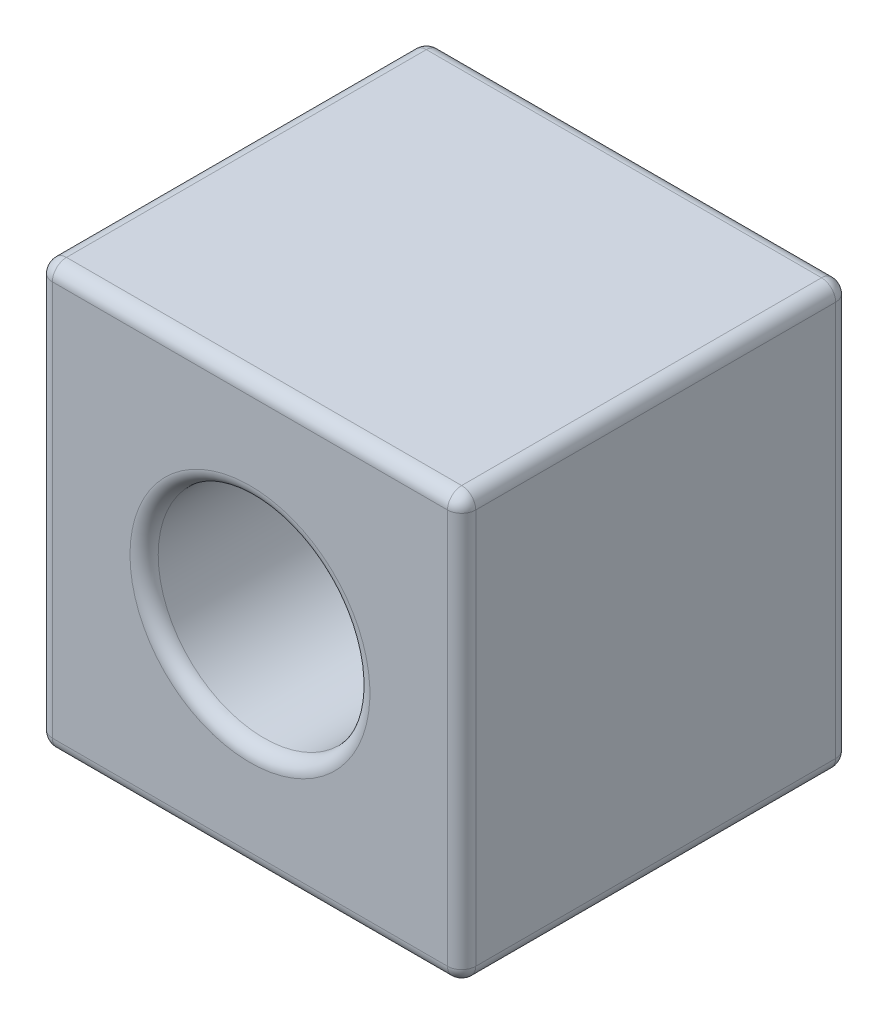
ISO-10303-21;
HEADER;
FILE_DESCRIPTION(('STEP AP214'),'2;1');
FILE_NAME('part.step','',(''),(''),'','','');
FILE_SCHEMA(('AUTOMOTIVE_DESIGN { 1 0 10303 214 1 1 1 1 }'));
ENDSEC;
DATA;
#1=APPLICATION_CONTEXT('core data for automotive mechanical design processes');
#2=APPLICATION_PROTOCOL_DEFINITION('international standard','automotive_design',2000,#1);
#3=PRODUCT_CONTEXT('',#1,'mechanical');
#4=PRODUCT('Part','Part','',(#3));
#5=PRODUCT_RELATED_PRODUCT_CATEGORY('part','',(#4));
#6=PRODUCT_DEFINITION_FORMATION('','',#4);
#7=PRODUCT_DEFINITION_CONTEXT('part definition',#1,'design');
#8=PRODUCT_DEFINITION('design','',#6,#7);
#9=PRODUCT_DEFINITION_SHAPE('','',#8);
#10=(LENGTH_UNIT() NAMED_UNIT(*) SI_UNIT(.MILLI.,.METRE.));
#11=(NAMED_UNIT(*) PLANE_ANGLE_UNIT() SI_UNIT($,.RADIAN.));
#12=(NAMED_UNIT(*) SI_UNIT($,.STERADIAN.) SOLID_ANGLE_UNIT());
#13=UNCERTAINTY_MEASURE_WITH_UNIT(LENGTH_MEASURE(1.E-05),#10,'distance_accuracy_value','');
#14=(GEOMETRIC_REPRESENTATION_CONTEXT(3) GLOBAL_UNCERTAINTY_ASSIGNED_CONTEXT((#13)) GLOBAL_UNIT_ASSIGNED_CONTEXT((#10,
#11,#12)) REPRESENTATION_CONTEXT('',''));
#15=CARTESIAN_POINT('',(0.,0.,0.));
#16=DIRECTION('',(0.,0.,1.));
#17=DIRECTION('',(1.,0.,0.));
#18=AXIS2_PLACEMENT_3D('',#15,#16,#17);
#19=CARTESIAN_POINT('',(-2.8,2.8,5.5));
#20=DIRECTION('',(0.,0.,-1.));
#21=DIRECTION('',(-1.,0.,0.));
#22=AXIS2_PLACEMENT_3D('',#19,#20,#21);
#23=PLANE('',#22);
#24=CARTESIAN_POINT('',(0.,0.,5.5));
#25=DIRECTION('',(0.,0.,-1.));
#26=DIRECTION('',(-1.,0.,0.));
#27=AXIS2_PLACEMENT_3D('',#24,#25,#26);
#28=CIRCLE('',#27,1.7);
#29=CARTESIAN_POINT('',(-1.7,0.,5.5));
#30=VERTEX_POINT('',#29);
#31=EDGE_CURVE('E11',#30,#30,#28,.T.);
#32=ORIENTED_EDGE('',*,*,#31,.T.);
#33=EDGE_LOOP('',(#32));
#34=FACE_BOUND('',#33,.T.);
#35=DIRECTION('',(0.,1.,0.));
#36=VECTOR('',#35,1.);
#37=CARTESIAN_POINT('',(2.8,2.8,5.5));
#38=LINE('',#37,#36);
#39=CARTESIAN_POINT('',(2.8,-2.8,5.5));
#40=VERTEX_POINT('',#39);
#41=CARTESIAN_POINT('',(2.8,2.8,5.5));
#42=VERTEX_POINT('',#41);
#43=EDGE_CURVE('E50',#40,#42,#38,.T.);
#44=ORIENTED_EDGE('',*,*,#43,.T.);
#45=DIRECTION('',(-1.,0.,0.));
#46=VECTOR('',#45,1.);
#47=CARTESIAN_POINT('',(-2.8,2.8,5.5));
#48=LINE('',#47,#46);
#49=CARTESIAN_POINT('',(-2.8,2.8,5.5));
#50=VERTEX_POINT('',#49);
#51=EDGE_CURVE('E43',#42,#50,#48,.T.);
#52=ORIENTED_EDGE('',*,*,#51,.T.);
#53=DIRECTION('',(0.,-1.,0.));
#54=VECTOR('',#53,1.);
#55=CARTESIAN_POINT('',(-2.8,2.8,5.5));
#56=LINE('',#55,#54);
#57=CARTESIAN_POINT('',(-2.8,-2.8,5.5));
#58=VERTEX_POINT('',#57);
#59=EDGE_CURVE('E206',#50,#58,#56,.T.);
#60=ORIENTED_EDGE('',*,*,#59,.T.);
#61=DIRECTION('',(1.,0.,0.));
#62=VECTOR('',#61,1.);
#63=CARTESIAN_POINT('',(-2.8,-2.8,5.5));
#64=LINE('',#63,#62);
#65=EDGE_CURVE('E55',#58,#40,#64,.T.);
#66=ORIENTED_EDGE('',*,*,#65,.T.);
#67=EDGE_LOOP('',(#44,#52,#60,#66));
#68=FACE_BOUND('',#67,.T.);
#69=ADVANCED_FACE('F35',(#34,#68),#23,.F.);
#70=CARTESIAN_POINT('',(-2.8,2.8,0.));
#71=DIRECTION('',(0.,0.,-1.));
#72=DIRECTION('',(-1.,0.,0.));
#73=AXIS2_PLACEMENT_3D('',#70,#71,#72);
#74=PLANE('',#73);
#75=CARTESIAN_POINT('',(0.,0.,0.));
#76=DIRECTION('',(0.,0.,-1.));
#77=DIRECTION('',(-1.,0.,0.));
#78=AXIS2_PLACEMENT_3D('',#75,#76,#77);
#79=CIRCLE('',#78,1.7);
#80=CARTESIAN_POINT('',(-1.7,0.,0.));
#81=VERTEX_POINT('',#80);
#82=EDGE_CURVE('E161',#81,#81,#79,.F.);
#83=ORIENTED_EDGE('',*,*,#82,.T.);
#84=EDGE_LOOP('',(#83));
#85=FACE_BOUND('',#84,.T.);
#86=DIRECTION('',(1.,0.,0.));
#87=VECTOR('',#86,1.);
#88=CARTESIAN_POINT('',(-2.8,-2.8,0.));
#89=LINE('',#88,#87);
#90=CARTESIAN_POINT('',(2.8,-2.8,0.));
#91=VERTEX_POINT('',#90);
#92=CARTESIAN_POINT('',(-2.8,-2.8,0.));
#93=VERTEX_POINT('',#92);
#94=EDGE_CURVE('E159',#91,#93,#89,.F.);
#95=ORIENTED_EDGE('',*,*,#94,.T.);
#96=DIRECTION('',(0.,-1.,0.));
#97=VECTOR('',#96,1.);
#98=CARTESIAN_POINT('',(-2.8,2.8,0.));
#99=LINE('',#98,#97);
#100=CARTESIAN_POINT('',(-2.8,2.8,0.));
#101=VERTEX_POINT('',#100);
#102=EDGE_CURVE('E129',#93,#101,#99,.F.);
#103=ORIENTED_EDGE('',*,*,#102,.T.);
#104=DIRECTION('',(-1.,0.,0.));
#105=VECTOR('',#104,1.);
#106=CARTESIAN_POINT('',(2.8,2.8,0.));
#107=LINE('',#106,#105);
#108=CARTESIAN_POINT('',(2.8,2.8,0.));
#109=VERTEX_POINT('',#108);
#110=EDGE_CURVE('E148',#101,#109,#107,.F.);
#111=ORIENTED_EDGE('',*,*,#110,.T.);
#112=DIRECTION('',(0.,1.,0.));
#113=VECTOR('',#112,1.);
#114=CARTESIAN_POINT('',(2.8,-2.8,0.));
#115=LINE('',#114,#113);
#116=EDGE_CURVE('E154',#109,#91,#115,.F.);
#117=ORIENTED_EDGE('',*,*,#116,.T.);
#118=EDGE_LOOP('',(#95,#103,#111,#117));
#119=FACE_BOUND('',#118,.T.);
#120=ADVANCED_FACE('F157',(#85,#119),#74,.T.);
#121=CARTESIAN_POINT('',(-2.8,2.8,5.5));
#122=DIRECTION('',(0.,0.,-1.));
#123=DIRECTION('',(-1.,0.,0.));
#124=AXIS2_PLACEMENT_3D('',#121,#122,#123);
#125=CYLINDRICAL_SURFACE('',#124,0.2);
#126=DIRECTION('',(0.,0.,-1.));
#127=VECTOR('',#126,1.);
#128=CARTESIAN_POINT('',(-2.8,3.,5.5));
#129=LINE('',#128,#127);
#130=CARTESIAN_POINT('',(-2.8,3.,5.3));
#131=VERTEX_POINT('',#130);
#132=CARTESIAN_POINT('',(-2.8,3.,0.2));
#133=VERTEX_POINT('',#132);
#134=EDGE_CURVE('E261',#131,#133,#129,.T.);
#135=ORIENTED_EDGE('',*,*,#134,.T.);
#136=CARTESIAN_POINT('',(-2.8,2.8,0.2));
#137=DIRECTION('',(0.,0.,-1.));
#138=DIRECTION('',(-1.,0.,0.));
#139=AXIS2_PLACEMENT_3D('',#136,#137,#138);
#140=CIRCLE('',#139,0.2);
#141=CARTESIAN_POINT('',(-3.,2.8,0.2));
#142=VERTEX_POINT('',#141);
#143=EDGE_CURVE('E142',#133,#142,#140,.F.);
#144=ORIENTED_EDGE('',*,*,#143,.T.);
#145=DIRECTION('',(0.,0.,-1.));
#146=VECTOR('',#145,1.);
#147=CARTESIAN_POINT('',(-3.,2.8,5.5));
#148=LINE('',#147,#146);
#149=CARTESIAN_POINT('',(-3.,2.8,5.3));
#150=VERTEX_POINT('',#149);
#151=EDGE_CURVE('E155',#150,#142,#148,.T.);
#152=ORIENTED_EDGE('',*,*,#151,.F.);
#153=CARTESIAN_POINT('',(-2.8,2.8,5.3));
#154=DIRECTION('',(0.,0.,-1.));
#155=DIRECTION('',(-1.,0.,0.));
#156=AXIS2_PLACEMENT_3D('',#153,#154,#155);
#157=CIRCLE('',#156,0.2);
#158=EDGE_CURVE('E203',#150,#131,#157,.T.);
#159=ORIENTED_EDGE('',*,*,#158,.T.);
#160=EDGE_LOOP('',(#135,#144,#152,#159));
#161=FACE_BOUND('',#160,.T.);
#162=ADVANCED_FACE('F37',(#161),#125,.T.);
#163=CARTESIAN_POINT('',(-3.,2.8,5.5));
#164=DIRECTION('',(1.,0.,0.));
#165=DIRECTION('',(0.,0.,-1.));
#166=AXIS2_PLACEMENT_3D('',#163,#164,#165);
#167=PLANE('',#166);
#168=ORIENTED_EDGE('',*,*,#151,.T.);
#169=DIRECTION('',(0.,-1.,0.));
#170=VECTOR('',#169,1.);
#171=CARTESIAN_POINT('',(-3.,-2.8,0.2));
#172=LINE('',#171,#170);
#173=CARTESIAN_POINT('',(-3.,-2.8,0.2));
#174=VERTEX_POINT('',#173);
#175=EDGE_CURVE('E132',#142,#174,#172,.T.);
#176=ORIENTED_EDGE('',*,*,#175,.T.);
#177=DIRECTION('',(0.,0.,-1.));
#178=VECTOR('',#177,1.);
#179=CARTESIAN_POINT('',(-3.,-2.8,5.5));
#180=LINE('',#179,#178);
#181=CARTESIAN_POINT('',(-3.,-2.8,5.3));
#182=VERTEX_POINT('',#181);
#183=EDGE_CURVE('E279',#182,#174,#180,.T.);
#184=ORIENTED_EDGE('',*,*,#183,.F.);
#185=DIRECTION('',(0.,-1.,0.));
#186=VECTOR('',#185,1.);
#187=CARTESIAN_POINT('',(-3.,2.8,5.3));
#188=LINE('',#187,#186);
#189=EDGE_CURVE('E175',#182,#150,#188,.F.);
#190=ORIENTED_EDGE('',*,*,#189,.T.);
#191=EDGE_LOOP('',(#168,#176,#184,#190));
#192=FACE_BOUND('',#191,.T.);
#193=ADVANCED_FACE('F302',(#192),#167,.F.);
#194=CARTESIAN_POINT('',(-2.8,-2.8,5.5));
#195=DIRECTION('',(0.,0.,-1.));
#196=DIRECTION('',(-1.,0.,0.));
#197=AXIS2_PLACEMENT_3D('',#194,#195,#196);
#198=CYLINDRICAL_SURFACE('',#197,0.2);
#199=ORIENTED_EDGE('',*,*,#183,.T.);
#200=CARTESIAN_POINT('',(-2.8,-2.8,0.2));
#201=DIRECTION('',(0.,0.,-1.));
#202=DIRECTION('',(-1.,0.,0.));
#203=AXIS2_PLACEMENT_3D('',#200,#201,#202);
#204=CIRCLE('',#203,0.2);
#205=CARTESIAN_POINT('',(-2.8,-3.,0.2));
#206=VERTEX_POINT('',#205);
#207=EDGE_CURVE('E180',#174,#206,#204,.F.);
#208=ORIENTED_EDGE('',*,*,#207,.T.);
#209=DIRECTION('',(0.,0.,-1.));
#210=VECTOR('',#209,1.);
#211=CARTESIAN_POINT('',(-2.8,-3.,5.5));
#212=LINE('',#211,#210);
#213=CARTESIAN_POINT('',(-2.8,-3.,5.3));
#214=VERTEX_POINT('',#213);
#215=EDGE_CURVE('E276',#214,#206,#212,.T.);
#216=ORIENTED_EDGE('',*,*,#215,.F.);
#217=CARTESIAN_POINT('',(-2.8,-2.8,5.3));
#218=DIRECTION('',(0.,0.,-1.));
#219=DIRECTION('',(-1.,0.,0.));
#220=AXIS2_PLACEMENT_3D('',#217,#218,#219);
#221=CIRCLE('',#220,0.2);
#222=EDGE_CURVE('E178',#214,#182,#221,.T.);
#223=ORIENTED_EDGE('',*,*,#222,.T.);
#224=EDGE_LOOP('',(#199,#208,#216,#223));
#225=FACE_BOUND('',#224,.T.);
#226=ADVANCED_FACE('F304',(#225),#198,.T.);
#227=CARTESIAN_POINT('',(-2.8,-3.,5.5));
#228=DIRECTION('',(0.,1.,0.));
#229=DIRECTION('',(0.,0.,1.));
#230=AXIS2_PLACEMENT_3D('',#227,#228,#229);
#231=PLANE('',#230);
#232=ORIENTED_EDGE('',*,*,#215,.T.);
#233=DIRECTION('',(1.,0.,0.));
#234=VECTOR('',#233,1.);
#235=CARTESIAN_POINT('',(2.8,-3.,0.2));
#236=LINE('',#235,#234);
#237=CARTESIAN_POINT('',(2.8,-3.,0.2));
#238=VERTEX_POINT('',#237);
#239=EDGE_CURVE('E184',#206,#238,#236,.T.);
#240=ORIENTED_EDGE('',*,*,#239,.T.);
#241=DIRECTION('',(0.,0.,-1.));
#242=VECTOR('',#241,1.);
#243=CARTESIAN_POINT('',(2.8,-3.,5.5));
#244=LINE('',#243,#242);
#245=CARTESIAN_POINT('',(2.8,-3.,5.3));
#246=VERTEX_POINT('',#245);
#247=EDGE_CURVE('E273',#246,#238,#244,.T.);
#248=ORIENTED_EDGE('',*,*,#247,.F.);
#249=DIRECTION('',(1.,0.,0.));
#250=VECTOR('',#249,1.);
#251=CARTESIAN_POINT('',(-2.8,-3.,5.3));
#252=LINE('',#251,#250);
#253=EDGE_CURVE('E182',#246,#214,#252,.F.);
#254=ORIENTED_EDGE('',*,*,#253,.T.);
#255=EDGE_LOOP('',(#232,#240,#248,#254));
#256=FACE_BOUND('',#255,.T.);
#257=ADVANCED_FACE('F357',(#256),#231,.F.);
#258=CARTESIAN_POINT('',(2.8,-2.8,5.5));
#259=DIRECTION('',(0.,0.,-1.));
#260=DIRECTION('',(-1.,0.,0.));
#261=AXIS2_PLACEMENT_3D('',#258,#259,#260);
#262=CYLINDRICAL_SURFACE('',#261,0.2);
#263=ORIENTED_EDGE('',*,*,#247,.T.);
#264=CARTESIAN_POINT('',(2.8,-2.8,0.2));
#265=DIRECTION('',(0.,0.,-1.));
#266=DIRECTION('',(-1.,0.,0.));
#267=AXIS2_PLACEMENT_3D('',#264,#265,#266);
#268=CIRCLE('',#267,0.2);
#269=CARTESIAN_POINT('',(3.,-2.8,0.2));
#270=VERTEX_POINT('',#269);
#271=EDGE_CURVE('E188',#238,#270,#268,.F.);
#272=ORIENTED_EDGE('',*,*,#271,.T.);
#273=DIRECTION('',(0.,0.,-1.));
#274=VECTOR('',#273,1.);
#275=CARTESIAN_POINT('',(3.,-2.8,5.5));
#276=LINE('',#275,#274);
#277=CARTESIAN_POINT('',(3.,-2.8,5.3));
#278=VERTEX_POINT('',#277);
#279=EDGE_CURVE('E270',#278,#270,#276,.T.);
#280=ORIENTED_EDGE('',*,*,#279,.F.);
#281=CARTESIAN_POINT('',(2.8,-2.8,5.3));
#282=DIRECTION('',(0.,0.,-1.));
#283=DIRECTION('',(-1.,0.,0.));
#284=AXIS2_PLACEMENT_3D('',#281,#282,#283);
#285=CIRCLE('',#284,0.2);
#286=EDGE_CURVE('E186',#278,#246,#285,.T.);
#287=ORIENTED_EDGE('',*,*,#286,.T.);
#288=EDGE_LOOP('',(#263,#272,#280,#287));
#289=FACE_BOUND('',#288,.T.);
#290=ADVANCED_FACE('F353',(#289),#262,.T.);
#291=CARTESIAN_POINT('',(3.,2.8,5.5));
#292=DIRECTION('',(-1.,0.,0.));
#293=DIRECTION('',(0.,0.,1.));
#294=AXIS2_PLACEMENT_3D('',#291,#292,#293);
#295=PLANE('',#294);
#296=ORIENTED_EDGE('',*,*,#279,.T.);
#297=DIRECTION('',(0.,1.,0.));
#298=VECTOR('',#297,1.);
#299=CARTESIAN_POINT('',(3.,2.8,0.2));
#300=LINE('',#299,#298);
#301=CARTESIAN_POINT('',(3.,2.8,0.2));
#302=VERTEX_POINT('',#301);
#303=EDGE_CURVE('E192',#270,#302,#300,.T.);
#304=ORIENTED_EDGE('',*,*,#303,.T.);
#305=DIRECTION('',(0.,0.,-1.));
#306=VECTOR('',#305,1.);
#307=CARTESIAN_POINT('',(3.,2.8,5.5));
#308=LINE('',#307,#306);
#309=CARTESIAN_POINT('',(3.,2.8,5.3));
#310=VERTEX_POINT('',#309);
#311=EDGE_CURVE('E267',#310,#302,#308,.T.);
#312=ORIENTED_EDGE('',*,*,#311,.F.);
#313=DIRECTION('',(0.,1.,0.));
#314=VECTOR('',#313,1.);
#315=CARTESIAN_POINT('',(3.,2.8,5.3));
#316=LINE('',#315,#314);
#317=EDGE_CURVE('E190',#310,#278,#316,.F.);
#318=ORIENTED_EDGE('',*,*,#317,.T.);
#319=EDGE_LOOP('',(#296,#304,#312,#318));
#320=FACE_BOUND('',#319,.T.);
#321=ADVANCED_FACE('F350',(#320),#295,.F.);
#322=CARTESIAN_POINT('',(2.8,2.8,5.5));
#323=DIRECTION('',(0.,0.,-1.));
#324=DIRECTION('',(-1.,0.,0.));
#325=AXIS2_PLACEMENT_3D('',#322,#323,#324);
#326=CYLINDRICAL_SURFACE('',#325,0.2);
#327=ORIENTED_EDGE('',*,*,#311,.T.);
#328=CARTESIAN_POINT('',(2.8,2.8,0.2));
#329=DIRECTION('',(0.,0.,-1.));
#330=DIRECTION('',(-1.,0.,0.));
#331=AXIS2_PLACEMENT_3D('',#328,#329,#330);
#332=CIRCLE('',#331,0.2);
#333=CARTESIAN_POINT('',(2.8,3.,0.2));
#334=VERTEX_POINT('',#333);
#335=EDGE_CURVE('E196',#302,#334,#332,.F.);
#336=ORIENTED_EDGE('',*,*,#335,.T.);
#337=DIRECTION('',(0.,0.,-1.));
#338=VECTOR('',#337,1.);
#339=CARTESIAN_POINT('',(2.8,3.,5.5));
#340=LINE('',#339,#338);
#341=CARTESIAN_POINT('',(2.8,3.,5.3));
#342=VERTEX_POINT('',#341);
#343=EDGE_CURVE('E264',#342,#334,#340,.T.);
#344=ORIENTED_EDGE('',*,*,#343,.F.);
#345=CARTESIAN_POINT('',(2.8,2.8,5.3));
#346=DIRECTION('',(0.,0.,-1.));
#347=DIRECTION('',(-1.,0.,0.));
#348=AXIS2_PLACEMENT_3D('',#345,#346,#347);
#349=CIRCLE('',#348,0.2);
#350=EDGE_CURVE('E194',#342,#310,#349,.T.);
#351=ORIENTED_EDGE('',*,*,#350,.T.);
#352=EDGE_LOOP('',(#327,#336,#344,#351));
#353=FACE_BOUND('',#352,.T.);
#354=ADVANCED_FACE('F326',(#353),#326,.T.);
#355=CARTESIAN_POINT('',(-2.8,3.,5.5));
#356=DIRECTION('',(0.,-1.,0.));
#357=DIRECTION('',(0.,0.,-1.));
#358=AXIS2_PLACEMENT_3D('',#355,#356,#357);
#359=PLANE('',#358);
#360=ORIENTED_EDGE('',*,*,#343,.T.);
#361=DIRECTION('',(-1.,0.,0.));
#362=VECTOR('',#361,1.);
#363=CARTESIAN_POINT('',(-2.8,3.,0.2));
#364=LINE('',#363,#362);
#365=EDGE_CURVE('E201',#334,#133,#364,.T.);
#366=ORIENTED_EDGE('',*,*,#365,.T.);
#367=ORIENTED_EDGE('',*,*,#134,.F.);
#368=DIRECTION('',(-1.,0.,0.));
#369=VECTOR('',#368,1.);
#370=CARTESIAN_POINT('',(-2.8,3.,5.3));
#371=LINE('',#370,#369);
#372=EDGE_CURVE('E198',#131,#342,#371,.F.);
#373=ORIENTED_EDGE('',*,*,#372,.T.);
#374=EDGE_LOOP('',(#360,#366,#367,#373));
#375=FACE_BOUND('',#374,.T.);
#376=ADVANCED_FACE('F325',(#375),#359,.F.);
#377=CARTESIAN_POINT('',(0.,0.,5.5));
#378=DIRECTION('',(0.,0.,-1.));
#379=DIRECTION('',(-1.,0.,0.));
#380=AXIS2_PLACEMENT_3D('',#377,#378,#379);
#381=CYLINDRICAL_SURFACE('',#380,1.5);
#382=CARTESIAN_POINT('',(0.,0.,0.2));
#383=DIRECTION('',(0.,0.,-1.));
#384=DIRECTION('',(-1.,0.,0.));
#385=AXIS2_PLACEMENT_3D('',#382,#383,#384);
#386=CIRCLE('',#385,1.5);
#387=CARTESIAN_POINT('',(-1.5,0.,0.2));
#388=VERTEX_POINT('',#387);
#389=EDGE_CURVE('E171',#388,#388,#386,.T.);
#390=ORIENTED_EDGE('',*,*,#389,.T.);
#391=EDGE_LOOP('',(#390));
#392=FACE_BOUND('',#391,.T.);
#393=CARTESIAN_POINT('',(0.,0.,5.3));
#394=DIRECTION('',(0.,0.,-1.));
#395=DIRECTION('',(-1.,0.,0.));
#396=AXIS2_PLACEMENT_3D('',#393,#394,#395);
#397=CIRCLE('',#396,1.5);
#398=CARTESIAN_POINT('',(-1.5,0.,5.3));
#399=VERTEX_POINT('',#398);
#400=EDGE_CURVE('E164',#399,#399,#397,.F.);
#401=ORIENTED_EDGE('',*,*,#400,.T.);
#402=EDGE_LOOP('',(#401));
#403=FACE_BOUND('',#402,.T.);
#404=ADVANCED_FACE('F347',(#392,#403),#381,.F.);
#405=CARTESIAN_POINT('',(0.,0.,0.2));
#406=DIRECTION('',(0.,0.,-1.));
#407=DIRECTION('',(-1.,0.,0.));
#408=AXIS2_PLACEMENT_3D('',#405,#406,#407);
#409=TOROIDAL_SURFACE('',#408,1.7,0.2);
#410=ORIENTED_EDGE('',*,*,#389,.F.);
#411=EDGE_LOOP('',(#410));
#412=FACE_BOUND('',#411,.T.);
#413=ORIENTED_EDGE('',*,*,#82,.F.);
#414=EDGE_LOOP('',(#413));
#415=FACE_BOUND('',#414,.T.);
#416=ADVANCED_FACE('F394',(#412,#415),#409,.T.);
#417=CARTESIAN_POINT('',(2.8,2.8,0.2));
#418=DIRECTION('',(0.,-1.,0.));
#419=DIRECTION('',(0.,0.,-1.));
#420=AXIS2_PLACEMENT_3D('',#417,#418,#419);
#421=CYLINDRICAL_SURFACE('',#420,0.2);
#422=CARTESIAN_POINT('',(2.8,2.8,0.2));
#423=DIRECTION('',(0.,1.,0.));
#424=DIRECTION('',(0.,0.,1.));
#425=AXIS2_PLACEMENT_3D('',#422,#423,#424);
#426=CIRCLE('',#425,0.2);
#427=EDGE_CURVE('E258',#302,#109,#426,.T.);
#428=ORIENTED_EDGE('',*,*,#427,.F.);
#429=ORIENTED_EDGE('',*,*,#303,.F.);
#430=CARTESIAN_POINT('',(2.8,-2.8,0.2));
#431=DIRECTION('',(0.,-1.,0.));
#432=DIRECTION('',(1.,0.,0.));
#433=AXIS2_PLACEMENT_3D('',#430,#431,#432);
#434=CIRCLE('',#433,0.2);
#435=EDGE_CURVE('E255',#91,#270,#434,.T.);
#436=ORIENTED_EDGE('',*,*,#435,.F.);
#437=ORIENTED_EDGE('',*,*,#116,.F.);
#438=EDGE_LOOP('',(#428,#429,#436,#437));
#439=FACE_BOUND('',#438,.T.);
#440=ADVANCED_FACE('F288',(#439),#421,.T.);
#441=CARTESIAN_POINT('',(2.8,2.8,0.2));
#442=DIRECTION('',(0.,0.,1.));
#443=DIRECTION('',(1.,0.,0.));
#444=AXIS2_PLACEMENT_3D('',#441,#442,#443);
#445=SPHERICAL_SURFACE('',#444,0.2);
#446=ORIENTED_EDGE('',*,*,#335,.F.);
#447=ORIENTED_EDGE('',*,*,#427,.T.);
#448=CARTESIAN_POINT('',(2.8,2.8,0.2));
#449=DIRECTION('',(-1.,0.,0.));
#450=DIRECTION('',(0.,-1.,0.));
#451=AXIS2_PLACEMENT_3D('',#448,#449,#450);
#452=CIRCLE('',#451,0.2);
#453=EDGE_CURVE('E151',#334,#109,#452,.T.);
#454=ORIENTED_EDGE('',*,*,#453,.F.);
#455=EDGE_LOOP('',(#446,#447,#454));
#456=FACE_BOUND('',#455,.T.);
#457=ADVANCED_FACE('F329',(#456),#445,.T.);
#458=CARTESIAN_POINT('',(2.8,-2.8,0.2));
#459=DIRECTION('',(0.,0.,1.));
#460=DIRECTION('',(1.,0.,0.));
#461=AXIS2_PLACEMENT_3D('',#458,#459,#460);
#462=SPHERICAL_SURFACE('',#461,0.2);
#463=ORIENTED_EDGE('',*,*,#435,.T.);
#464=ORIENTED_EDGE('',*,*,#271,.F.);
#465=CARTESIAN_POINT('',(2.8,-2.8,0.2));
#466=DIRECTION('',(-1.,0.,0.));
#467=DIRECTION('',(0.,-1.,0.));
#468=AXIS2_PLACEMENT_3D('',#465,#466,#467);
#469=CIRCLE('',#468,0.2);
#470=EDGE_CURVE('E145',#91,#238,#469,.T.);
#471=ORIENTED_EDGE('',*,*,#470,.F.);
#472=EDGE_LOOP('',(#463,#464,#471));
#473=FACE_BOUND('',#472,.T.);
#474=ADVANCED_FACE('F291',(#473),#462,.T.);
#475=CARTESIAN_POINT('',(-2.8,2.8,0.2));
#476=DIRECTION('',(1.,0.,0.));
#477=DIRECTION('',(0.,0.,-1.));
#478=AXIS2_PLACEMENT_3D('',#475,#476,#477);
#479=CYLINDRICAL_SURFACE('',#478,0.2);
#480=ORIENTED_EDGE('',*,*,#453,.T.);
#481=ORIENTED_EDGE('',*,*,#110,.F.);
#482=CARTESIAN_POINT('',(-2.8,2.8,0.2));
#483=DIRECTION('',(-1.,0.,0.));
#484=DIRECTION('',(0.,0.,1.));
#485=AXIS2_PLACEMENT_3D('',#482,#483,#484);
#486=CIRCLE('',#485,0.2);
#487=EDGE_CURVE('E139',#133,#101,#486,.T.);
#488=ORIENTED_EDGE('',*,*,#487,.F.);
#489=ORIENTED_EDGE('',*,*,#365,.F.);
#490=EDGE_LOOP('',(#480,#481,#488,#489));
#491=FACE_BOUND('',#490,.T.);
#492=ADVANCED_FACE('F149',(#491),#479,.T.);
#493=CARTESIAN_POINT('',(-2.8,-2.8,0.2));
#494=DIRECTION('',(-1.,0.,0.));
#495=DIRECTION('',(0.,0.,1.));
#496=AXIS2_PLACEMENT_3D('',#493,#494,#495);
#497=CYLINDRICAL_SURFACE('',#496,0.2);
#498=ORIENTED_EDGE('',*,*,#470,.T.);
#499=ORIENTED_EDGE('',*,*,#239,.F.);
#500=CARTESIAN_POINT('',(-2.8,-2.8,0.2));
#501=DIRECTION('',(-1.,0.,0.));
#502=DIRECTION('',(0.,-1.,0.));
#503=AXIS2_PLACEMENT_3D('',#500,#501,#502);
#504=CIRCLE('',#503,0.2);
#505=EDGE_CURVE('E135',#93,#206,#504,.T.);
#506=ORIENTED_EDGE('',*,*,#505,.F.);
#507=ORIENTED_EDGE('',*,*,#94,.F.);
#508=EDGE_LOOP('',(#498,#499,#506,#507));
#509=FACE_BOUND('',#508,.T.);
#510=ADVANCED_FACE('F294',(#509),#497,.T.);
#511=CARTESIAN_POINT('',(-2.8,2.8,0.2));
#512=DIRECTION('',(0.,0.,1.));
#513=DIRECTION('',(1.,0.,0.));
#514=AXIS2_PLACEMENT_3D('',#511,#512,#513);
#515=SPHERICAL_SURFACE('',#514,0.2);
#516=ORIENTED_EDGE('',*,*,#143,.F.);
#517=ORIENTED_EDGE('',*,*,#487,.T.);
#518=CARTESIAN_POINT('',(-2.8,2.8,0.2));
#519=DIRECTION('',(0.,-1.,0.));
#520=DIRECTION('',(1.,0.,0.));
#521=AXIS2_PLACEMENT_3D('',#518,#519,#520);
#522=CIRCLE('',#521,0.2);
#523=EDGE_CURVE('E125',#142,#101,#522,.T.);
#524=ORIENTED_EDGE('',*,*,#523,.F.);
#525=EDGE_LOOP('',(#516,#517,#524));
#526=FACE_BOUND('',#525,.T.);
#527=ADVANCED_FACE('F141',(#526),#515,.T.);
#528=CARTESIAN_POINT('',(-2.8,-2.8,0.2));
#529=DIRECTION('',(0.,0.,1.));
#530=DIRECTION('',(1.,0.,0.));
#531=AXIS2_PLACEMENT_3D('',#528,#529,#530);
#532=SPHERICAL_SURFACE('',#531,0.2);
#533=ORIENTED_EDGE('',*,*,#505,.T.);
#534=ORIENTED_EDGE('',*,*,#207,.F.);
#535=CARTESIAN_POINT('',(-2.8,-2.8,0.2));
#536=DIRECTION('',(0.,1.,0.));
#537=DIRECTION('',(-1.,0.,0.));
#538=AXIS2_PLACEMENT_3D('',#535,#536,#537);
#539=CIRCLE('',#538,0.2);
#540=EDGE_CURVE('E136',#93,#174,#539,.T.);
#541=ORIENTED_EDGE('',*,*,#540,.F.);
#542=EDGE_LOOP('',(#533,#534,#541));
#543=FACE_BOUND('',#542,.T.);
#544=ADVANCED_FACE('F297',(#543),#532,.T.);
#545=CARTESIAN_POINT('',(-2.8,2.8,0.2));
#546=DIRECTION('',(0.,1.,0.));
#547=DIRECTION('',(0.,0.,1.));
#548=AXIS2_PLACEMENT_3D('',#545,#546,#547);
#549=CYLINDRICAL_SURFACE('',#548,0.2);
#550=ORIENTED_EDGE('',*,*,#523,.T.);
#551=ORIENTED_EDGE('',*,*,#102,.F.);
#552=ORIENTED_EDGE('',*,*,#540,.T.);
#553=ORIENTED_EDGE('',*,*,#175,.F.);
#554=EDGE_LOOP('',(#550,#551,#552,#553));
#555=FACE_BOUND('',#554,.T.);
#556=ADVANCED_FACE('F127',(#555),#549,.T.);
#557=CARTESIAN_POINT('',(0.,0.,5.3));
#558=DIRECTION('',(0.,0.,-1.));
#559=DIRECTION('',(-1.,0.,0.));
#560=AXIS2_PLACEMENT_3D('',#557,#558,#559);
#561=TOROIDAL_SURFACE('',#560,1.7,0.2);
#562=ORIENTED_EDGE('',*,*,#31,.F.);
#563=EDGE_LOOP('',(#562));
#564=FACE_BOUND('',#563,.T.);
#565=ORIENTED_EDGE('',*,*,#400,.F.);
#566=EDGE_LOOP('',(#565));
#567=FACE_BOUND('',#566,.T.);
#568=ADVANCED_FACE('F449',(#564,#567),#561,.T.);
#569=CARTESIAN_POINT('',(-2.8,-2.8,5.3));
#570=DIRECTION('',(1.,0.,0.));
#571=DIRECTION('',(0.,0.,-1.));
#572=AXIS2_PLACEMENT_3D('',#569,#570,#571);
#573=CYLINDRICAL_SURFACE('',#572,0.2);
#574=CARTESIAN_POINT('',(-2.8,-2.8,5.3));
#575=DIRECTION('',(-1.,0.,0.));
#576=DIRECTION('',(0.,0.,1.));
#577=AXIS2_PLACEMENT_3D('',#574,#575,#576);
#578=CIRCLE('',#577,0.2);
#579=EDGE_CURVE('E240',#214,#58,#578,.T.);
#580=ORIENTED_EDGE('',*,*,#579,.F.);
#581=ORIENTED_EDGE('',*,*,#253,.F.);
#582=CARTESIAN_POINT('',(2.8,-2.8,5.3));
#583=DIRECTION('',(1.,0.,0.));
#584=DIRECTION('',(0.,1.,0.));
#585=AXIS2_PLACEMENT_3D('',#582,#583,#584);
#586=CIRCLE('',#585,0.2);
#587=EDGE_CURVE('E246',#40,#246,#586,.T.);
#588=ORIENTED_EDGE('',*,*,#587,.F.);
#589=ORIENTED_EDGE('',*,*,#65,.F.);
#590=EDGE_LOOP('',(#580,#581,#588,#589));
#591=FACE_BOUND('',#590,.T.);
#592=ADVANCED_FACE('F309',(#591),#573,.T.);
#593=CARTESIAN_POINT('',(2.8,-2.8,5.3));
#594=DIRECTION('',(0.,0.,1.));
#595=DIRECTION('',(1.,0.,0.));
#596=AXIS2_PLACEMENT_3D('',#593,#594,#595);
#597=SPHERICAL_SURFACE('',#596,0.2);
#598=ORIENTED_EDGE('',*,*,#587,.T.);
#599=ORIENTED_EDGE('',*,*,#286,.F.);
#600=CARTESIAN_POINT('',(2.8,-2.8,5.3));
#601=DIRECTION('',(0.,1.,0.));
#602=DIRECTION('',(-1.,0.,0.));
#603=AXIS2_PLACEMENT_3D('',#600,#601,#602);
#604=CIRCLE('',#603,0.2);
#605=EDGE_CURVE('E237',#40,#278,#604,.T.);
#606=ORIENTED_EDGE('',*,*,#605,.F.);
#607=EDGE_LOOP('',(#598,#599,#606));
#608=FACE_BOUND('',#607,.T.);
#609=ADVANCED_FACE('F313',(#608),#597,.T.);
#610=CARTESIAN_POINT('',(-2.8,-2.8,5.3));
#611=DIRECTION('',(0.,0.,1.));
#612=DIRECTION('',(1.,0.,0.));
#613=AXIS2_PLACEMENT_3D('',#610,#611,#612);
#614=SPHERICAL_SURFACE('',#613,0.2);
#615=ORIENTED_EDGE('',*,*,#222,.F.);
#616=ORIENTED_EDGE('',*,*,#579,.T.);
#617=CARTESIAN_POINT('',(-2.8,-2.8,5.3));
#618=DIRECTION('',(0.,1.,0.));
#619=DIRECTION('',(-1.,0.,0.));
#620=AXIS2_PLACEMENT_3D('',#617,#618,#619);
#621=CIRCLE('',#620,0.2);
#622=EDGE_CURVE('E233',#182,#58,#621,.T.);
#623=ORIENTED_EDGE('',*,*,#622,.F.);
#624=EDGE_LOOP('',(#615,#616,#623));
#625=FACE_BOUND('',#624,.T.);
#626=ADVANCED_FACE('F306',(#625),#614,.T.);
#627=CARTESIAN_POINT('',(2.8,2.8,5.3));
#628=DIRECTION('',(0.,1.,0.));
#629=DIRECTION('',(0.,0.,1.));
#630=AXIS2_PLACEMENT_3D('',#627,#628,#629);
#631=CYLINDRICAL_SURFACE('',#630,0.2);
#632=ORIENTED_EDGE('',*,*,#605,.T.);
#633=ORIENTED_EDGE('',*,*,#317,.F.);
#634=CARTESIAN_POINT('',(2.8,2.8,5.3));
#635=DIRECTION('',(0.,1.,0.));
#636=DIRECTION('',(-1.,0.,0.));
#637=AXIS2_PLACEMENT_3D('',#634,#635,#636);
#638=CIRCLE('',#637,0.2);
#639=EDGE_CURVE('E228',#42,#310,#638,.T.);
#640=ORIENTED_EDGE('',*,*,#639,.F.);
#641=ORIENTED_EDGE('',*,*,#43,.F.);
#642=EDGE_LOOP('',(#632,#633,#640,#641));
#643=FACE_BOUND('',#642,.T.);
#644=ADVANCED_FACE('F316',(#643),#631,.T.);
#645=CARTESIAN_POINT('',(-2.8,2.8,5.3));
#646=DIRECTION('',(0.,-1.,0.));
#647=DIRECTION('',(0.,0.,-1.));
#648=AXIS2_PLACEMENT_3D('',#645,#646,#647);
#649=CYLINDRICAL_SURFACE('',#648,0.2);
#650=ORIENTED_EDGE('',*,*,#622,.T.);
#651=ORIENTED_EDGE('',*,*,#59,.F.);
#652=CARTESIAN_POINT('',(-2.8,2.8,5.3));
#653=DIRECTION('',(0.,1.,0.));
#654=DIRECTION('',(0.,0.,1.));
#655=AXIS2_PLACEMENT_3D('',#652,#653,#654);
#656=CIRCLE('',#655,0.2);
#657=EDGE_CURVE('E224',#150,#50,#656,.T.);
#658=ORIENTED_EDGE('',*,*,#657,.F.);
#659=ORIENTED_EDGE('',*,*,#189,.F.);
#660=EDGE_LOOP('',(#650,#651,#658,#659));
#661=FACE_BOUND('',#660,.T.);
#662=ADVANCED_FACE('F231',(#661),#649,.T.);
#663=CARTESIAN_POINT('',(2.8,2.8,5.3));
#664=DIRECTION('',(0.,0.,1.));
#665=DIRECTION('',(1.,0.,0.));
#666=AXIS2_PLACEMENT_3D('',#663,#664,#665);
#667=SPHERICAL_SURFACE('',#666,0.2);
#668=ORIENTED_EDGE('',*,*,#639,.T.);
#669=ORIENTED_EDGE('',*,*,#350,.F.);
#670=CARTESIAN_POINT('',(2.8,2.8,5.3));
#671=DIRECTION('',(-1.,0.,0.));
#672=DIRECTION('',(0.,-1.,0.));
#673=AXIS2_PLACEMENT_3D('',#670,#671,#672);
#674=CIRCLE('',#673,0.2);
#675=EDGE_CURVE('E215',#42,#342,#674,.T.);
#676=ORIENTED_EDGE('',*,*,#675,.F.);
#677=EDGE_LOOP('',(#668,#669,#676));
#678=FACE_BOUND('',#677,.T.);
#679=ADVANCED_FACE('F318',(#678),#667,.T.);
#680=CARTESIAN_POINT('',(-2.8,2.8,5.3));
#681=DIRECTION('',(0.,0.,1.));
#682=DIRECTION('',(1.,0.,0.));
#683=AXIS2_PLACEMENT_3D('',#680,#681,#682);
#684=SPHERICAL_SURFACE('',#683,0.2);
#685=ORIENTED_EDGE('',*,*,#158,.F.);
#686=ORIENTED_EDGE('',*,*,#657,.T.);
#687=CARTESIAN_POINT('',(-2.8,2.8,5.3));
#688=DIRECTION('',(1.,0.,0.));
#689=DIRECTION('',(0.,1.,0.));
#690=AXIS2_PLACEMENT_3D('',#687,#688,#689);
#691=CIRCLE('',#690,0.2);
#692=EDGE_CURVE('E218',#131,#50,#691,.T.);
#693=ORIENTED_EDGE('',*,*,#692,.F.);
#694=EDGE_LOOP('',(#685,#686,#693));
#695=FACE_BOUND('',#694,.T.);
#696=ADVANCED_FACE('F225',(#695),#684,.T.);
#697=CARTESIAN_POINT('',(-2.8,2.8,5.3));
#698=DIRECTION('',(-1.,0.,0.));
#699=DIRECTION('',(0.,0.,1.));
#700=AXIS2_PLACEMENT_3D('',#697,#698,#699);
#701=CYLINDRICAL_SURFACE('',#700,0.2);
#702=ORIENTED_EDGE('',*,*,#675,.T.);
#703=ORIENTED_EDGE('',*,*,#372,.F.);
#704=ORIENTED_EDGE('',*,*,#692,.T.);
#705=ORIENTED_EDGE('',*,*,#51,.F.);
#706=EDGE_LOOP('',(#702,#703,#704,#705));
#707=FACE_BOUND('',#706,.T.);
#708=ADVANCED_FACE('F212',(#707),#701,.T.);
#709=CLOSED_SHELL('',(#69,#120,#162,#193,#226,#257,#290,#321,#354,#376,#404,#416,#440,#457,#474,
#492,#510,#527,#544,#556,#568,#592,#609,#626,#644,#662,#679,#696,#708));
#710=MANIFOLD_SOLID_BREP('B2',#709);
#711=ADVANCED_BREP_SHAPE_REPRESENTATION('',(#18,#710),#14);
#712=SHAPE_DEFINITION_REPRESENTATION(#9,#711);
ENDSEC;
END-ISO-10303-21;
